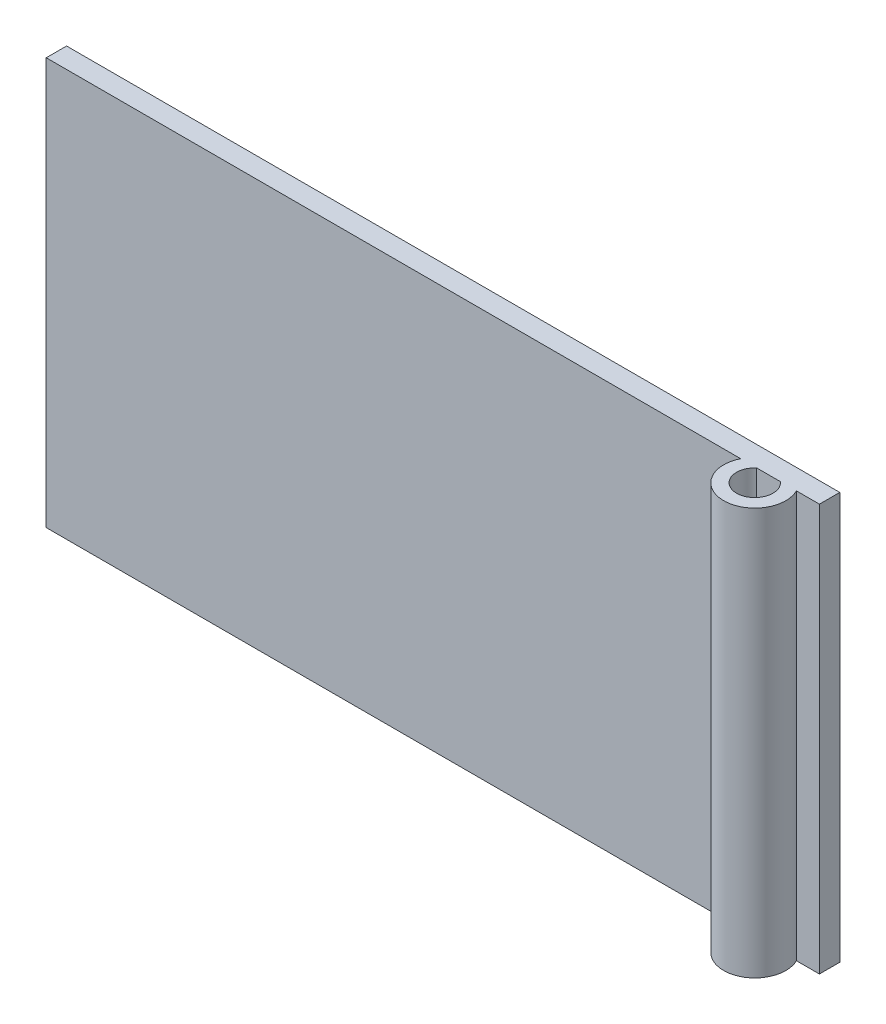
ISO-10303-21;
HEADER;
FILE_DESCRIPTION(('STEP AP214'),'2;1');
FILE_NAME('part.step','',(''),(''),'','','');
FILE_SCHEMA(('AUTOMOTIVE_DESIGN { 1 0 10303 214 1 1 1 1 }'));
ENDSEC;
DATA;
#1=APPLICATION_CONTEXT('core data for automotive mechanical design processes');
#2=APPLICATION_PROTOCOL_DEFINITION('international standard','automotive_design',2000,#1);
#3=PRODUCT_CONTEXT('',#1,'mechanical');
#4=PRODUCT('Part','Part','',(#3));
#5=PRODUCT_RELATED_PRODUCT_CATEGORY('part','',(#4));
#6=PRODUCT_DEFINITION_FORMATION('','',#4);
#7=PRODUCT_DEFINITION_CONTEXT('part definition',#1,'design');
#8=PRODUCT_DEFINITION('design','',#6,#7);
#9=PRODUCT_DEFINITION_SHAPE('','',#8);
#10=(LENGTH_UNIT() NAMED_UNIT(*) SI_UNIT(.MILLI.,.METRE.));
#11=(NAMED_UNIT(*) PLANE_ANGLE_UNIT() SI_UNIT($,.RADIAN.));
#12=(NAMED_UNIT(*) SI_UNIT($,.STERADIAN.) SOLID_ANGLE_UNIT());
#13=UNCERTAINTY_MEASURE_WITH_UNIT(LENGTH_MEASURE(1.E-05),#10,'distance_accuracy_value','');
#14=(GEOMETRIC_REPRESENTATION_CONTEXT(3) GLOBAL_UNCERTAINTY_ASSIGNED_CONTEXT((#13)) GLOBAL_UNIT_ASSIGNED_CONTEXT((#10,
#11,#12)) REPRESENTATION_CONTEXT('',''));
#15=CARTESIAN_POINT('',(0.,0.,0.));
#16=DIRECTION('',(0.,0.,1.));
#17=DIRECTION('',(1.,0.,0.));
#18=AXIS2_PLACEMENT_3D('',#15,#16,#17);
#19=CARTESIAN_POINT('',(0.,0.,10.));
#20=DIRECTION('',(0.,0.,-1.));
#21=DIRECTION('',(-1.,0.,0.));
#22=AXIS2_PLACEMENT_3D('',#19,#20,#21);
#23=PLANE('',#22);
#24=DIRECTION('',(0.,-1.,0.));
#25=VECTOR('',#24,1.);
#26=CARTESIAN_POINT('',(178.691792718581,143.200381998794,10.));
#27=LINE('',#26,#25);
#28=CARTESIAN_POINT('',(178.691792718581,-100.,10.));
#29=VERTEX_POINT('',#28);
#30=CARTESIAN_POINT('',(178.691792718581,100.,10.));
#31=VERTEX_POINT('',#30);
#32=EDGE_CURVE('E11',#29,#31,#27,.F.);
#33=ORIENTED_EDGE('',*,*,#32,.F.);
#34=DIRECTION('',(1.,0.,0.));
#35=VECTOR('',#34,1.);
#36=CARTESIAN_POINT('',(-190.,-100.,10.));
#37=LINE('',#36,#35);
#38=CARTESIAN_POINT('',(190.,-100.,10.));
#39=VERTEX_POINT('',#38);
#40=EDGE_CURVE('E101',#29,#39,#37,.T.);
#41=ORIENTED_EDGE('',*,*,#40,.T.);
#42=DIRECTION('',(0.,1.,0.));
#43=VECTOR('',#42,1.);
#44=CARTESIAN_POINT('',(190.,-100.,10.));
#45=LINE('',#44,#43);
#46=CARTESIAN_POINT('',(190.,100.,10.));
#47=VERTEX_POINT('',#46);
#48=EDGE_CURVE('E130',#39,#47,#45,.T.);
#49=ORIENTED_EDGE('',*,*,#48,.T.);
#50=DIRECTION('',(-1.,0.,0.));
#51=VECTOR('',#50,1.);
#52=CARTESIAN_POINT('',(-190.,100.,10.));
#53=LINE('',#52,#51);
#54=EDGE_CURVE('E114',#47,#31,#53,.T.);
#55=ORIENTED_EDGE('',*,*,#54,.T.);
#56=EDGE_LOOP('',(#33,#41,#49,#55));
#57=FACE_BOUND('',#56,.T.);
#58=ADVANCED_FACE('F36',(#57),#23,.F.);
#59=DIRECTION('',(0.,-1.,0.));
#60=VECTOR('',#59,1.);
#61=CARTESIAN_POINT('',(151.317921363713,143.200381998794,10.));
#62=LINE('',#61,#60);
#63=CARTESIAN_POINT('',(151.317921363713,100.,10.));
#64=VERTEX_POINT('',#63);
#65=CARTESIAN_POINT('',(151.317921363713,-100.,10.));
#66=VERTEX_POINT('',#65);
#67=EDGE_CURVE('E44',#64,#66,#62,.T.);
#68=ORIENTED_EDGE('',*,*,#67,.F.);
#69=CARTESIAN_POINT('',(-190.,100.,10.));
#70=VERTEX_POINT('',#69);
#71=EDGE_CURVE('E132',#64,#70,#53,.T.);
#72=ORIENTED_EDGE('',*,*,#71,.T.);
#73=DIRECTION('',(0.,-1.,0.));
#74=VECTOR('',#73,1.);
#75=CARTESIAN_POINT('',(-190.,-100.,10.));
#76=LINE('',#75,#74);
#77=CARTESIAN_POINT('',(-190.,-100.,10.));
#78=VERTEX_POINT('',#77);
#79=EDGE_CURVE('E112',#70,#78,#76,.T.);
#80=ORIENTED_EDGE('',*,*,#79,.T.);
#81=EDGE_CURVE('E59',#78,#66,#37,.T.);
#82=ORIENTED_EDGE('',*,*,#81,.T.);
#83=EDGE_LOOP('',(#68,#72,#80,#82));
#84=FACE_BOUND('',#83,.T.);
#85=ADVANCED_FACE('F175',(#84),#23,.F.);
#86=CARTESIAN_POINT('',(190.,-100.,10.));
#87=DIRECTION('',(-1.,0.,0.));
#88=DIRECTION('',(0.,0.,1.));
#89=AXIS2_PLACEMENT_3D('',#86,#87,#88);
#90=PLANE('',#89);
#91=DIRECTION('',(0.,1.,0.));
#92=VECTOR('',#91,1.);
#93=CARTESIAN_POINT('',(190.,-100.,0.));
#94=LINE('',#93,#92);
#95=CARTESIAN_POINT('',(190.,-100.,0.));
#96=VERTEX_POINT('',#95);
#97=CARTESIAN_POINT('',(190.,100.,0.));
#98=VERTEX_POINT('',#97);
#99=EDGE_CURVE('E129',#96,#98,#94,.T.);
#100=ORIENTED_EDGE('',*,*,#99,.T.);
#101=DIRECTION('',(0.,0.,-1.));
#102=VECTOR('',#101,1.);
#103=CARTESIAN_POINT('',(190.,100.,10.));
#104=LINE('',#103,#102);
#105=EDGE_CURVE('E151',#47,#98,#104,.T.);
#106=ORIENTED_EDGE('',*,*,#105,.F.);
#107=ORIENTED_EDGE('',*,*,#48,.F.);
#108=DIRECTION('',(0.,0.,-1.));
#109=VECTOR('',#108,1.);
#110=CARTESIAN_POINT('',(190.,-100.,10.));
#111=LINE('',#110,#109);
#112=EDGE_CURVE('E108',#39,#96,#111,.T.);
#113=ORIENTED_EDGE('',*,*,#112,.T.);
#114=EDGE_LOOP('',(#100,#106,#107,#113));
#115=FACE_BOUND('',#114,.T.);
#116=ADVANCED_FACE('F38',(#115),#90,.F.);
#117=CARTESIAN_POINT('',(-190.,100.,10.));
#118=DIRECTION('',(0.,-1.,0.));
#119=DIRECTION('',(0.,0.,-1.));
#120=AXIS2_PLACEMENT_3D('',#117,#118,#119);
#121=PLANE('',#120);
#122=ORIENTED_EDGE('',*,*,#71,.F.);
#123=CARTESIAN_POINT('',(165.004857041147,100.,16.7787843576122));
#124=DIRECTION('',(0.,-1.,0.));
#125=DIRECTION('',(0.,0.,-1.));
#126=AXIS2_PLACEMENT_3D('',#123,#124,#125);
#127=CIRCLE('',#126,15.2736415305984);
#128=EDGE_CURVE('E122',#31,#64,#127,.T.);
#129=ORIENTED_EDGE('',*,*,#128,.F.);
#130=ORIENTED_EDGE('',*,*,#54,.F.);
#131=ORIENTED_EDGE('',*,*,#105,.T.);
#132=DIRECTION('',(-1.,0.,0.));
#133=VECTOR('',#132,1.);
#134=CARTESIAN_POINT('',(-190.,100.,0.));
#135=LINE('',#134,#133);
#136=CARTESIAN_POINT('',(-190.,100.,0.));
#137=VERTEX_POINT('',#136);
#138=EDGE_CURVE('E139',#98,#137,#135,.T.);
#139=ORIENTED_EDGE('',*,*,#138,.T.);
#140=DIRECTION('',(0.,0.,-1.));
#141=VECTOR('',#140,1.);
#142=CARTESIAN_POINT('',(-190.,100.,10.));
#143=LINE('',#142,#141);
#144=EDGE_CURVE('E148',#70,#137,#143,.T.);
#145=ORIENTED_EDGE('',*,*,#144,.F.);
#146=EDGE_LOOP('',(#122,#129,#130,#131,#139,#145));
#147=FACE_BOUND('',#146,.T.);
#148=CARTESIAN_POINT('',(170.837958937476,100.,10.));
#149=VERTEX_POINT('',#148);
#150=CARTESIAN_POINT('',(159.171755144819,100.,10.));
#151=VERTEX_POINT('',#150);
#152=EDGE_CURVE('E135',#149,#151,#53,.T.);
#153=ORIENTED_EDGE('',*,*,#152,.F.);
#154=CARTESIAN_POINT('',(165.004857041147,100.,16.7787843576122));
#155=DIRECTION('',(0.,-1.,0.));
#156=DIRECTION('',(0.,0.,-1.));
#157=AXIS2_PLACEMENT_3D('',#154,#155,#156);
#158=CIRCLE('',#157,8.94298580452628);
#159=EDGE_CURVE('E126',#149,#151,#158,.T.);
#160=ORIENTED_EDGE('',*,*,#159,.T.);
#161=EDGE_LOOP('',(#153,#160));
#162=FACE_BOUND('',#161,.T.);
#163=ADVANCED_FACE('F164',(#147,#162),#121,.F.);
#164=CARTESIAN_POINT('',(-190.,-100.,10.));
#165=DIRECTION('',(1.,0.,0.));
#166=DIRECTION('',(0.,0.,-1.));
#167=AXIS2_PLACEMENT_3D('',#164,#165,#166);
#168=PLANE('',#167);
#169=DIRECTION('',(0.,-1.,0.));
#170=VECTOR('',#169,1.);
#171=CARTESIAN_POINT('',(-190.,-100.,0.));
#172=LINE('',#171,#170);
#173=CARTESIAN_POINT('',(-190.,-100.,0.));
#174=VERTEX_POINT('',#173);
#175=EDGE_CURVE('E141',#137,#174,#172,.T.);
#176=ORIENTED_EDGE('',*,*,#175,.T.);
#177=DIRECTION('',(0.,0.,-1.));
#178=VECTOR('',#177,1.);
#179=CARTESIAN_POINT('',(-190.,-100.,10.));
#180=LINE('',#179,#178);
#181=EDGE_CURVE('E145',#78,#174,#180,.T.);
#182=ORIENTED_EDGE('',*,*,#181,.F.);
#183=ORIENTED_EDGE('',*,*,#79,.F.);
#184=ORIENTED_EDGE('',*,*,#144,.T.);
#185=EDGE_LOOP('',(#176,#182,#183,#184));
#186=FACE_BOUND('',#185,.T.);
#187=ADVANCED_FACE('F167',(#186),#168,.F.);
#188=CARTESIAN_POINT('',(-190.,-100.,10.));
#189=DIRECTION('',(0.,1.,0.));
#190=DIRECTION('',(0.,0.,1.));
#191=AXIS2_PLACEMENT_3D('',#188,#189,#190);
#192=PLANE('',#191);
#193=ORIENTED_EDGE('',*,*,#40,.F.);
#194=CARTESIAN_POINT('',(165.004857041147,-100.,16.7787843576122));
#195=DIRECTION('',(0.,1.,0.));
#196=DIRECTION('',(0.,0.,1.));
#197=AXIS2_PLACEMENT_3D('',#194,#195,#196);
#198=CIRCLE('',#197,15.2736415305984);
#199=EDGE_CURVE('E106',#29,#66,#198,.F.);
#200=ORIENTED_EDGE('',*,*,#199,.T.);
#201=ORIENTED_EDGE('',*,*,#81,.F.);
#202=ORIENTED_EDGE('',*,*,#181,.T.);
#203=DIRECTION('',(1.,0.,0.));
#204=VECTOR('',#203,1.);
#205=CARTESIAN_POINT('',(-190.,-100.,0.));
#206=LINE('',#205,#204);
#207=EDGE_CURVE('E133',#174,#96,#206,.T.);
#208=ORIENTED_EDGE('',*,*,#207,.T.);
#209=ORIENTED_EDGE('',*,*,#112,.F.);
#210=EDGE_LOOP('',(#193,#200,#201,#202,#208,#209));
#211=FACE_BOUND('',#210,.T.);
#212=CARTESIAN_POINT('',(159.171755144819,-100.,10.));
#213=VERTEX_POINT('',#212);
#214=CARTESIAN_POINT('',(170.837958937476,-100.,10.));
#215=VERTEX_POINT('',#214);
#216=EDGE_CURVE('E51',#213,#215,#37,.T.);
#217=ORIENTED_EDGE('',*,*,#216,.F.);
#218=CARTESIAN_POINT('',(165.004857041147,-100.,16.7787843576122));
#219=DIRECTION('',(0.,1.,0.));
#220=DIRECTION('',(0.,0.,1.));
#221=AXIS2_PLACEMENT_3D('',#218,#219,#220);
#222=CIRCLE('',#221,8.94298580452628);
#223=EDGE_CURVE('E119',#215,#213,#222,.F.);
#224=ORIENTED_EDGE('',*,*,#223,.F.);
#225=EDGE_LOOP('',(#217,#224));
#226=FACE_BOUND('',#225,.T.);
#227=ADVANCED_FACE('F103',(#211,#226),#192,.F.);
#228=ORIENTED_EDGE('',*,*,#216,.T.);
#229=DIRECTION('',(0.,-1.,0.));
#230=VECTOR('',#229,1.);
#231=CARTESIAN_POINT('',(170.837958937476,143.200381998794,10.));
#232=LINE('',#231,#230);
#233=EDGE_CURVE('E156',#215,#149,#232,.F.);
#234=ORIENTED_EDGE('',*,*,#233,.T.);
#235=ORIENTED_EDGE('',*,*,#152,.T.);
#236=DIRECTION('',(0.,-1.,0.));
#237=VECTOR('',#236,1.);
#238=CARTESIAN_POINT('',(159.171755144819,143.200381998794,10.));
#239=LINE('',#238,#237);
#240=EDGE_CURVE('E154',#151,#213,#239,.T.);
#241=ORIENTED_EDGE('',*,*,#240,.T.);
#242=EDGE_LOOP('',(#228,#234,#235,#241));
#243=FACE_BOUND('',#242,.T.);
#244=ADVANCED_FACE('F158',(#243),#23,.F.);
#245=CARTESIAN_POINT('',(0.,0.,0.));
#246=DIRECTION('',(0.,0.,-1.));
#247=DIRECTION('',(-1.,0.,0.));
#248=AXIS2_PLACEMENT_3D('',#245,#246,#247);
#249=PLANE('',#248);
#250=ORIENTED_EDGE('',*,*,#99,.F.);
#251=ORIENTED_EDGE('',*,*,#207,.F.);
#252=ORIENTED_EDGE('',*,*,#175,.F.);
#253=ORIENTED_EDGE('',*,*,#138,.F.);
#254=EDGE_LOOP('',(#250,#251,#252,#253));
#255=FACE_BOUND('',#254,.T.);
#256=ADVANCED_FACE('F173',(#255),#249,.T.);
#257=CARTESIAN_POINT('',(165.004857041147,143.200381998794,16.7787843576122));
#258=DIRECTION('',(0.,-1.,0.));
#259=DIRECTION('',(0.,0.,-1.));
#260=AXIS2_PLACEMENT_3D('',#257,#258,#259);
#261=CYLINDRICAL_SURFACE('',#260,15.2736415305984);
#262=ORIENTED_EDGE('',*,*,#199,.F.);
#263=ORIENTED_EDGE('',*,*,#32,.T.);
#264=ORIENTED_EDGE('',*,*,#128,.T.);
#265=ORIENTED_EDGE('',*,*,#67,.T.);
#266=EDGE_LOOP('',(#262,#263,#264,#265));
#267=FACE_BOUND('',#266,.T.);
#268=ADVANCED_FACE('F118',(#267),#261,.T.);
#269=CARTESIAN_POINT('',(165.004857041147,143.200381998794,16.7787843576122));
#270=DIRECTION('',(0.,-1.,0.));
#271=DIRECTION('',(0.,0.,-1.));
#272=AXIS2_PLACEMENT_3D('',#269,#270,#271);
#273=CYLINDRICAL_SURFACE('',#272,8.94298580452628);
#274=ORIENTED_EDGE('',*,*,#233,.F.);
#275=ORIENTED_EDGE('',*,*,#223,.T.);
#276=ORIENTED_EDGE('',*,*,#240,.F.);
#277=ORIENTED_EDGE('',*,*,#159,.F.);
#278=EDGE_LOOP('',(#274,#275,#276,#277));
#279=FACE_BOUND('',#278,.T.);
#280=ADVANCED_FACE('F165',(#279),#273,.F.);
#281=CLOSED_SHELL('',(#58,#85,#116,#163,#187,#227,#244,#256,#268,#280));
#282=MANIFOLD_SOLID_BREP('B2',#281);
#283=ADVANCED_BREP_SHAPE_REPRESENTATION('',(#18,#282),#14);
#284=SHAPE_DEFINITION_REPRESENTATION(#9,#283);
ENDSEC;
END-ISO-10303-21;
